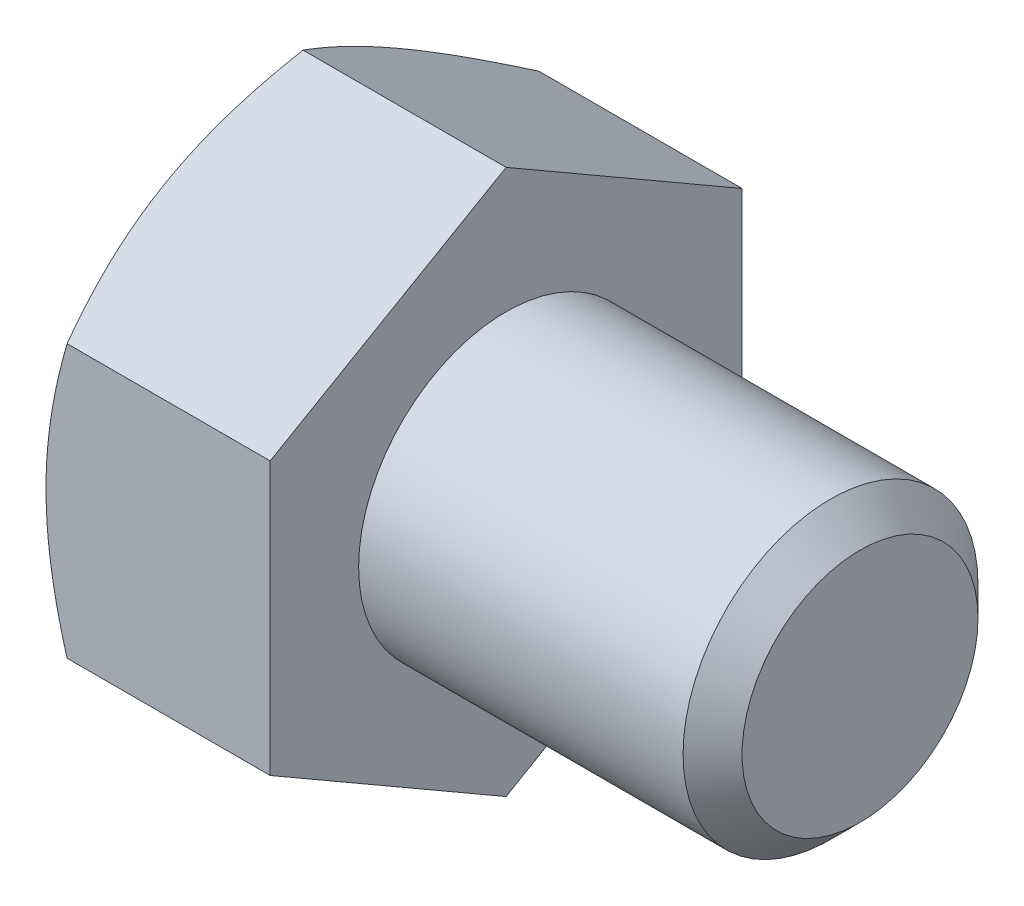
ISO-10303-21;
HEADER;
FILE_DESCRIPTION(('STEP AP214'),'2;1');
FILE_NAME('part.step','',(''),(''),'','','');
FILE_SCHEMA(('AUTOMOTIVE_DESIGN { 1 0 10303 214 1 1 1 1 }'));
ENDSEC;
DATA;
#1=APPLICATION_CONTEXT('core data for automotive mechanical design processes');
#2=APPLICATION_PROTOCOL_DEFINITION('international standard','automotive_design',2000,#1);
#3=PRODUCT_CONTEXT('',#1,'mechanical');
#4=PRODUCT('Part','Part','',(#3));
#5=PRODUCT_RELATED_PRODUCT_CATEGORY('part','',(#4));
#6=PRODUCT_DEFINITION_FORMATION('','',#4);
#7=PRODUCT_DEFINITION_CONTEXT('part definition',#1,'design');
#8=PRODUCT_DEFINITION('design','',#6,#7);
#9=PRODUCT_DEFINITION_SHAPE('','',#8);
#10=(LENGTH_UNIT() NAMED_UNIT(*) SI_UNIT(.MILLI.,.METRE.));
#11=(NAMED_UNIT(*) PLANE_ANGLE_UNIT() SI_UNIT($,.RADIAN.));
#12=(NAMED_UNIT(*) SI_UNIT($,.STERADIAN.) SOLID_ANGLE_UNIT());
#13=UNCERTAINTY_MEASURE_WITH_UNIT(LENGTH_MEASURE(1.E-05),#10,'distance_accuracy_value','');
#14=(GEOMETRIC_REPRESENTATION_CONTEXT(3) GLOBAL_UNCERTAINTY_ASSIGNED_CONTEXT((#13)) GLOBAL_UNIT_ASSIGNED_CONTEXT((#10,
#11,#12)) REPRESENTATION_CONTEXT('',''));
#15=CARTESIAN_POINT('',(0.,0.,0.));
#16=DIRECTION('',(0.,0.,1.));
#17=DIRECTION('',(1.,0.,0.));
#18=AXIS2_PLACEMENT_3D('',#15,#16,#17);
#19=CARTESIAN_POINT('',(3.8,2.5,0.));
#20=DIRECTION('',(-1.,0.,0.));
#21=DIRECTION('',(0.,0.,1.));
#22=AXIS2_PLACEMENT_3D('',#19,#20,#21);
#23=PLANE('',#22);
#24=CARTESIAN_POINT('',(3.8,0.,0.));
#25=DIRECTION('',(-1.,0.,0.));
#26=DIRECTION('',(0.,0.,1.));
#27=AXIS2_PLACEMENT_3D('',#24,#25,#26);
#28=CIRCLE('',#27,2.5);
#29=CARTESIAN_POINT('',(3.8,0.,2.5));
#30=VERTEX_POINT('',#29);
#31=EDGE_CURVE('E193',#30,#30,#28,.T.);
#32=ORIENTED_EDGE('',*,*,#31,.T.);
#33=EDGE_LOOP('',(#32));
#34=FACE_BOUND('',#33,.T.);
#35=DIRECTION('',(0.,1.,0.));
#36=VECTOR('',#35,1.);
#37=CARTESIAN_POINT('',(3.8,-2.30940108685021,4.));
#38=LINE('',#37,#36);
#39=CARTESIAN_POINT('',(3.8,-2.30940108685021,4.));
#40=VERTEX_POINT('',#39);
#41=CARTESIAN_POINT('',(3.8,2.30940108685047,4.));
#42=VERTEX_POINT('',#41);
#43=EDGE_CURVE('E57',#40,#42,#38,.T.);
#44=ORIENTED_EDGE('',*,*,#43,.F.);
#45=DIRECTION('',(0.,0.50000000163871,0.866025402838329));
#46=VECTOR('',#45,1.);
#47=CARTESIAN_POINT('',(3.8,-4.61880217370055,0.));
#48=LINE('',#47,#46);
#49=CARTESIAN_POINT('',(3.8,-4.61880217370055,0.));
#50=VERTEX_POINT('',#49);
#51=EDGE_CURVE('E130',#50,#40,#48,.T.);
#52=ORIENTED_EDGE('',*,*,#51,.F.);
#53=DIRECTION('',(0.,-0.50000000163871,0.866025402838329));
#54=VECTOR('',#53,1.);
#55=CARTESIAN_POINT('',(3.8,-2.30940108685021,-4.));
#56=LINE('',#55,#54);
#57=CARTESIAN_POINT('',(3.8,-2.30940108685021,-4.));
#58=VERTEX_POINT('',#57);
#59=EDGE_CURVE('E128',#58,#50,#56,.T.);
#60=ORIENTED_EDGE('',*,*,#59,.F.);
#61=DIRECTION('',(0.,-1.,0.));
#62=VECTOR('',#61,1.);
#63=CARTESIAN_POINT('',(3.8,2.30940108685047,-4.));
#64=LINE('',#63,#62);
#65=CARTESIAN_POINT('',(3.8,2.30940108685047,-4.));
#66=VERTEX_POINT('',#65);
#67=EDGE_CURVE('E111',#66,#58,#64,.T.);
#68=ORIENTED_EDGE('',*,*,#67,.F.);
#69=DIRECTION('',(0.,-0.50000000163871,-0.866025402838329));
#70=VECTOR('',#69,1.);
#71=CARTESIAN_POINT('',(3.8,4.61880217370081,0.));
#72=LINE('',#71,#70);
#73=CARTESIAN_POINT('',(3.8,4.61880217370081,0.));
#74=VERTEX_POINT('',#73);
#75=EDGE_CURVE('E120',#74,#66,#72,.T.);
#76=ORIENTED_EDGE('',*,*,#75,.F.);
#77=DIRECTION('',(0.,0.50000000163871,-0.866025402838329));
#78=VECTOR('',#77,1.);
#79=CARTESIAN_POINT('',(3.8,2.30940108685047,4.));
#80=LINE('',#79,#78);
#81=EDGE_CURVE('E124',#42,#74,#80,.T.);
#82=ORIENTED_EDGE('',*,*,#81,.F.);
#83=EDGE_LOOP('',(#44,#52,#60,#68,#76,#82));
#84=FACE_BOUND('',#83,.T.);
#85=ADVANCED_FACE('F34',(#34,#84),#23,.F.);
#86=CARTESIAN_POINT('',(-25.4,0.,0.));
#87=DIRECTION('',(-1.,0.,0.));
#88=DIRECTION('',(0.,0.,1.));
#89=AXIS2_PLACEMENT_3D('',#86,#87,#88);
#90=CYLINDRICAL_SURFACE('',#89,2.5);
#91=CARTESIAN_POINT('',(9.29999999999999,0.,0.));
#92=DIRECTION('',(1.,0.,0.));
#93=DIRECTION('',(0.,0.,-1.));
#94=AXIS2_PLACEMENT_3D('',#91,#92,#93);
#95=CIRCLE('',#94,2.5);
#96=CARTESIAN_POINT('',(9.29999999999999,0.,-2.5));
#97=VERTEX_POINT('',#96);
#98=EDGE_CURVE('E42',#97,#97,#95,.F.);
#99=ORIENTED_EDGE('',*,*,#98,.T.);
#100=EDGE_LOOP('',(#99));
#101=FACE_BOUND('',#100,.T.);
#102=ORIENTED_EDGE('',*,*,#31,.F.);
#103=EDGE_LOOP('',(#102));
#104=FACE_BOUND('',#103,.T.);
#105=ADVANCED_FACE('F36',(#101,#104),#90,.T.);
#106=CARTESIAN_POINT('',(9.8,2.5,0.));
#107=DIRECTION('',(1.,0.,0.));
#108=DIRECTION('',(0.,0.,-1.));
#109=AXIS2_PLACEMENT_3D('',#106,#107,#108);
#110=PLANE('',#109);
#111=CARTESIAN_POINT('',(9.8,0.,0.));
#112=DIRECTION('',(1.,0.,0.));
#113=DIRECTION('',(0.,0.,-1.));
#114=AXIS2_PLACEMENT_3D('',#111,#112,#113);
#115=CIRCLE('',#114,2.);
#116=CARTESIAN_POINT('',(9.8,0.,-2.));
#117=VERTEX_POINT('',#116);
#118=EDGE_CURVE('E11',#117,#117,#115,.T.);
#119=ORIENTED_EDGE('',*,*,#118,.T.);
#120=EDGE_LOOP('',(#119));
#121=FACE_BOUND('',#120,.T.);
#122=ADVANCED_FACE('F176',(#121),#110,.T.);
#123=CARTESIAN_POINT('',(3.8,-2.30940108685021,4.));
#124=DIRECTION('',(0.,0.,1.));
#125=DIRECTION('',(0.,-1.,0.));
#126=AXIS2_PLACEMENT_3D('',#123,#124,#125);
#127=PLANE('',#126);
#128=DIRECTION('',(-1.,0.,0.));
#129=VECTOR('',#128,1.);
#130=CARTESIAN_POINT('',(3.8,-2.30940108685021,4.));
#131=LINE('',#130,#129);
#132=CARTESIAN_POINT('',(0.35726559282139,-2.30940108685021,4.));
#133=VERTEX_POINT('',#132);
#134=EDGE_CURVE('E137',#40,#133,#131,.T.);
#135=ORIENTED_EDGE('',*,*,#134,.F.);
#136=ORIENTED_EDGE('',*,*,#43,.T.);
#137=DIRECTION('',(-1.,0.,0.));
#138=VECTOR('',#137,1.);
#139=CARTESIAN_POINT('',(3.8,2.30940108685047,4.));
#140=LINE('',#139,#138);
#141=CARTESIAN_POINT('',(0.357265592821462,2.30940108685047,4.));
#142=VERTEX_POINT('',#141);
#143=EDGE_CURVE('E136',#42,#142,#140,.T.);
#144=ORIENTED_EDGE('',*,*,#143,.T.);
#145=CARTESIAN_POINT('',(1.91411207050557,-6.12488284911128,4.));
#146=CARTESIAN_POINT('',(1.82924143407423,-5.94926014497977,4.00000000000001));
#147=CARTESIAN_POINT('',(1.74521447868329,-5.77322221201618,4.));
#148=CARTESIAN_POINT('',(1.57933003819625,-5.42009137445534,4.));
#149=CARTESIAN_POINT('',(1.49747292871725,-5.24299829361886,4.));
#150=CARTESIAN_POINT('',(1.33597906289909,-4.88657600917898,4.));
#151=CARTESIAN_POINT('',(1.25635769330726,-4.70723980861795,4.));
#152=CARTESIAN_POINT('',(1.10053486918804,-4.3470934254322,4.));
#153=CARTESIAN_POINT('',(1.0243332363971,-4.16628332022092,4.));
#154=CARTESIAN_POINT('',(0.875354558746429,-3.80065688980505,4.));
#155=CARTESIAN_POINT('',(0.802631043961964,-3.61581863286855,4.));
#156=CARTESIAN_POINT('',(0.662879678014749,-3.24396193963803,4.));
#157=CARTESIAN_POINT('',(0.595852460533937,-3.05694326340907,4.));
#158=CARTESIAN_POINT('',(0.469294684217645,-2.68081230741806,4.));
#159=CARTESIAN_POINT('',(0.409748187612698,-2.49170544564091,4.));
#160=CARTESIAN_POINT('',(0.30008572336187,-2.11080331995523,4.));
#161=CARTESIAN_POINT('',(0.249966773457976,-1.91900892690383,4.));
#162=CARTESIAN_POINT('',(0.161592536574721,-1.53260074712083,4.));
#163=CARTESIAN_POINT('',(0.123340407870541,-1.33798622423089,4.));
#164=CARTESIAN_POINT('',(0.0612753077680044,-0.946410783763161,4.));
#165=CARTESIAN_POINT('',(0.0374623491237198,-0.749449864112967,4.));
#166=CARTESIAN_POINT('',(0.00638220331307707,-0.355459653933766,4.));
#167=CARTESIAN_POINT('',(-0.000989732727249493,-0.158438841624105,4.));
#168=CARTESIAN_POINT('',(0.00120381620110225,0.23546484051504,4.));
#169=CARTESIAN_POINT('',(0.010764904501223,0.432347732877177,4.));
#170=CARTESIAN_POINT('',(0.0408779562953358,0.768553458943435,4.));
#171=CARTESIAN_POINT('',(0.0575083510692321,0.908247206742812,4.));
#172=CARTESIAN_POINT('',(0.0982121199221649,1.18655561740683,4.));
#173=CARTESIAN_POINT('',(0.122286667829395,1.32517010655262,4.));
#174=CARTESIAN_POINT('',(0.20441305736776,1.73928168633864,4.));
#175=CARTESIAN_POINT('',(0.272346499738698,2.01283770618391,4.));
#176=CARTESIAN_POINT('',(0.389513421409693,2.4221727073608,4.));
#177=CARTESIAN_POINT('',(0.43171082242019,2.56008534252284,4.));
#178=CARTESIAN_POINT('',(0.520281102969559,2.83447117565622,4.));
#179=CARTESIAN_POINT('',(0.566651102551071,2.97094529491654,4.));
#180=CARTESIAN_POINT('',(0.662601699724829,3.24188340523882,4.));
#181=CARTESIAN_POINT('',(0.71216275686328,3.37635438688183,4.));
#182=CARTESIAN_POINT('',(0.814193851020142,3.64425303314445,4.));
#183=CARTESIAN_POINT('',(0.866665063740089,3.77768025087655,4.));
#184=CARTESIAN_POINT('',(0.920304177357636,3.91062502490282,4.));
#185=B_SPLINE_CURVE_WITH_KNOTS('',3,(#145,#146,#147,#148,#149,#150,#151,#152,#153,#154,#155,
#156,#157,#158,#159,#160,#161,#162,#163,#164,#165,#166,#167,#168,#169,#170,#171,#172,#173,#174,
#175,#176,#177,#178,#179,#180,#181,#182,#183,#184),.UNSPECIFIED.,.F.,.F.,(4,2,2,2,2,2,2,2,2,2,2,
2,2,2,2,2,2,2,2,4),(0.,0.585172133086107,1.17044491108198,1.75906694985072,2.34765826928943,
2.94347582869784,3.53935958302679,4.13395145670743,4.72835492300021,5.32291645035583,
5.91747850288497,6.50824153352631,7.09885119472812,7.52068574675965,7.94258684954709,
8.78701696632151,9.21965414324304,9.65199496834923,10.0819022935389,10.5119845844856),.UNSPECIFIED.);
#186=CARTESIAN_POINT('',(0.,0.,4.));
#187=VERTEX_POINT('',#186);
#188=EDGE_CURVE('E178',#187,#142,#185,.T.);
#189=ORIENTED_EDGE('',*,*,#188,.F.);
#190=EDGE_CURVE('E185',#133,#187,#185,.T.);
#191=ORIENTED_EDGE('',*,*,#190,.F.);
#192=EDGE_LOOP('',(#135,#136,#144,#189,#191));
#193=FACE_BOUND('',#192,.T.);
#194=ADVANCED_FACE('F172',(#193),#127,.T.);
#195=CARTESIAN_POINT('',(3.8,-4.61880217370055,0.));
#196=DIRECTION('',(0.,-0.866025402838329,0.50000000163871));
#197=DIRECTION('',(0.,-0.50000000163871,-0.866025402838329));
#198=AXIS2_PLACEMENT_3D('',#195,#196,#197);
#199=PLANE('',#198);
#200=DIRECTION('',(-1.,0.,0.));
#201=VECTOR('',#200,1.);
#202=CARTESIAN_POINT('',(3.8,-4.61880217370055,0.));
#203=LINE('',#202,#201);
#204=CARTESIAN_POINT('',(0.357265601561139,-4.61880217370055,0.));
#205=VERTEX_POINT('',#204);
#206=EDGE_CURVE('E141',#50,#205,#203,.T.);
#207=ORIENTED_EDGE('',*,*,#206,.F.);
#208=ORIENTED_EDGE('',*,*,#51,.T.);
#209=ORIENTED_EDGE('',*,*,#134,.T.);
#210=CARTESIAN_POINT('',(0.357332270728034,-4.61891764375489,-0.000200000000001266));
#211=CARTESIAN_POINT('',(0.298717884872984,-4.5174315032524,0.175579150846262));
#212=CARTESIAN_POINT('',(0.245410332260443,-4.41506934012742,0.352875617376607));
#213=CARTESIAN_POINT('',(0.152361680715636,-4.20857252264166,0.710538595300267));
#214=CARTESIAN_POINT('',(0.112653498596863,-4.10443419924972,0.890911461641944));
#215=CARTESIAN_POINT('',(0.0508422241018666,-3.89744814501029,1.24942182247619));
#216=CARTESIAN_POINT('',(0.0283277399997143,-3.79463226063427,1.42750415726238));
#217=CARTESIAN_POINT('',(0.00145063101350322,-3.58851673252128,1.7845067226229));
#218=CARTESIAN_POINT('',(-0.00293425097148781,-3.48521783790868,1.96342565567578));
#219=CARTESIAN_POINT('',(0.00619008011451904,-3.29219971594881,2.29774284823086));
#220=CARTESIAN_POINT('',(0.017458960889836,-3.20245158776585,2.45319116544867));
#221=CARTESIAN_POINT('',(0.0531739970667138,-3.0235400370613,2.76307505997572));
#222=CARTESIAN_POINT('',(0.0776323516191489,-2.93437723331403,2.91750956553643));
#223=CARTESIAN_POINT('',(0.13877607004079,-2.75509683061233,3.22803233046023));
#224=CARTESIAN_POINT('',(0.175720608348018,-2.66500192131106,3.38408129019142));
#225=CARTESIAN_POINT('',(0.259570076360999,-2.48615581226107,3.69385183644834));
#226=CARTESIAN_POINT('',(0.306455305574318,-2.3974023214031,3.84757739129168));
#227=CARTESIAN_POINT('',(0.35733226198763,-2.30928561679587,4.0002));
#228=B_SPLINE_CURVE_WITH_KNOTS('',3,(#210,#211,#212,#213,#214,#215,#216,#217,#218,#219,#220,
#221,#222,#223,#224,#225,#226,#227),.UNSPECIFIED.,.F.,.F.,(4,2,2,2,2,2,2,2,4),(0.,
0.634047838434344,1.26961969774217,1.88946158031554,2.5085422775577,3.04757826336224,
3.58711366925116,4.13861653785011,4.68903648524492),.UNSPECIFIED.);
#229=CARTESIAN_POINT('',(0.,-3.46410162270654,2.00000001310962));
#230=VERTEX_POINT('',#229);
#231=EDGE_CURVE('E187',#230,#133,#228,.T.);
#232=ORIENTED_EDGE('',*,*,#231,.F.);
#233=EDGE_CURVE('E186',#205,#230,#228,.T.);
#234=ORIENTED_EDGE('',*,*,#233,.F.);
#235=EDGE_LOOP('',(#207,#208,#209,#232,#234));
#236=FACE_BOUND('',#235,.T.);
#237=ADVANCED_FACE('F175',(#236),#199,.T.);
#238=CARTESIAN_POINT('',(3.8,-2.30940108685021,-4.));
#239=DIRECTION('',(0.,-0.866025402838329,-0.50000000163871));
#240=DIRECTION('',(0.,0.50000000163871,-0.866025402838329));
#241=AXIS2_PLACEMENT_3D('',#238,#239,#240);
#242=PLANE('',#241);
#243=DIRECTION('',(-1.,0.,0.));
#244=VECTOR('',#243,1.);
#245=CARTESIAN_POINT('',(3.8,-2.30940108685021,-4.));
#246=LINE('',#245,#244);
#247=CARTESIAN_POINT('',(0.35726559282139,-2.30940108685021,-4.));
#248=VERTEX_POINT('',#247);
#249=EDGE_CURVE('E117',#58,#248,#246,.T.);
#250=ORIENTED_EDGE('',*,*,#249,.F.);
#251=ORIENTED_EDGE('',*,*,#59,.T.);
#252=ORIENTED_EDGE('',*,*,#206,.T.);
#253=CARTESIAN_POINT('',(0.35733226198763,-2.30928561679587,-4.0002));
#254=CARTESIAN_POINT('',(0.298717876844807,-2.41077175705273,-3.82442084957919));
#255=CARTESIAN_POINT('',(0.245410324990068,-2.51313391993055,-3.64712438347694));
#256=CARTESIAN_POINT('',(0.152361675020789,-2.71963073689828,-3.28946140645052));
#257=CARTESIAN_POINT('',(0.112653493718921,-2.82376906001921,-3.10908854057826));
#258=CARTESIAN_POINT('',(0.0508422208496781,-3.03075511370645,-2.75057818070044));
#259=CARTESIAN_POINT('',(0.0283277375578539,-3.13357099780214,-2.57249584639978));
#260=CARTESIAN_POINT('',(0.0014506301340083,-3.33968652532137,-2.21549328206768));
#261=CARTESIAN_POINT('',(-0.0029342510984508,-3.44298541962059,-2.03657434955761));
#262=CARTESIAN_POINT('',(0.0061900812974301,-3.63600354156816,-1.70225715702381));
#263=CARTESIAN_POINT('',(0.0174589627405232,-3.72575167005462,-1.54680883928033));
#264=CARTESIAN_POINT('',(0.0531740002868179,-3.90466322134178,-1.23692494374417));
#265=CARTESIAN_POINT('',(0.0776323555410334,-3.99382602536814,-1.08249043770006));
#266=CARTESIAN_POINT('',(0.138776075372699,-4.17310642862236,-0.771967671819272));
#267=CARTESIAN_POINT('',(0.175720614388896,-4.26320133819654,-0.615918711615387));
#268=CARTESIAN_POINT('',(0.259570083783939,-4.44204744777679,-0.306148164440034));
#269=CARTESIAN_POINT('',(0.306455313670071,-4.53080093889216,-0.152422609150856));
#270=CARTESIAN_POINT('',(0.357332270728034,-4.61891764375489,0.000199999999998629));
#271=B_SPLINE_CURVE_WITH_KNOTS('',3,(#253,#254,#255,#256,#257,#258,#259,#260,#261,#262,#263,
#264,#265,#266,#267,#268,#269,#270),.UNSPECIFIED.,.F.,.F.,(4,2,2,2,2,2,2,2,4),(0.,
0.634047836422559,1.2696196936697,1.88946157430579,2.50854226962757,3.04757825737168,
3.58711366520643,4.1386165358392,4.68903648524489),.UNSPECIFIED.);
#272=CARTESIAN_POINT('',(0.,-3.46410162270654,-2.00000001310962));
#273=VERTEX_POINT('',#272);
#274=EDGE_CURVE('E257',#273,#205,#271,.T.);
#275=ORIENTED_EDGE('',*,*,#274,.F.);
#276=EDGE_CURVE('E266',#248,#273,#271,.T.);
#277=ORIENTED_EDGE('',*,*,#276,.F.);
#278=EDGE_LOOP('',(#250,#251,#252,#275,#277));
#279=FACE_BOUND('',#278,.T.);
#280=ADVANCED_FACE('F264',(#279),#242,.T.);
#281=CARTESIAN_POINT('',(3.8,2.30940108685047,-4.));
#282=DIRECTION('',(0.,0.,-1.));
#283=DIRECTION('',(-1.,0.,0.));
#284=AXIS2_PLACEMENT_3D('',#281,#282,#283);
#285=PLANE('',#284);
#286=DIRECTION('',(-1.,0.,0.));
#287=VECTOR('',#286,1.);
#288=CARTESIAN_POINT('',(3.8,2.30940108685047,-4.));
#289=LINE('',#288,#287);
#290=CARTESIAN_POINT('',(0.357265592821464,2.30940108685047,-4.));
#291=VERTEX_POINT('',#290);
#292=EDGE_CURVE('E106',#66,#291,#289,.T.);
#293=ORIENTED_EDGE('',*,*,#292,.F.);
#294=ORIENTED_EDGE('',*,*,#67,.T.);
#295=ORIENTED_EDGE('',*,*,#249,.T.);
#296=CARTESIAN_POINT('',(1.91411207050557,-6.12488284911128,-4.));
#297=CARTESIAN_POINT('',(1.82924143407423,-5.94926014497977,-4.));
#298=CARTESIAN_POINT('',(1.74521447868329,-5.77322221201618,-4.));
#299=CARTESIAN_POINT('',(1.57933003819625,-5.42009137445534,-4.));
#300=CARTESIAN_POINT('',(1.49747292871725,-5.24299829361886,-4.));
#301=CARTESIAN_POINT('',(1.33597906289909,-4.88657600917898,-4.));
#302=CARTESIAN_POINT('',(1.25635769330726,-4.70723980861795,-4.));
#303=CARTESIAN_POINT('',(1.10053486918804,-4.3470934254322,-4.));
#304=CARTESIAN_POINT('',(1.02433323639709,-4.16628332022092,-4.));
#305=CARTESIAN_POINT('',(0.875354558746428,-3.80065688980505,-4.));
#306=CARTESIAN_POINT('',(0.802631043961963,-3.61581863286855,-4.));
#307=CARTESIAN_POINT('',(0.662879678014749,-3.24396193963803,-4.));
#308=CARTESIAN_POINT('',(0.595852460533937,-3.05694326340907,-4.));
#309=CARTESIAN_POINT('',(0.469294684217645,-2.68081230741806,-4.));
#310=CARTESIAN_POINT('',(0.409748187612697,-2.49170544564091,-4.));
#311=CARTESIAN_POINT('',(0.30008572336187,-2.11080331995523,-4.));
#312=CARTESIAN_POINT('',(0.249966773457977,-1.91900892690383,-4.));
#313=CARTESIAN_POINT('',(0.161592536574723,-1.53260074712083,-4.));
#314=CARTESIAN_POINT('',(0.123340407870542,-1.33798622423089,-4.));
#315=CARTESIAN_POINT('',(0.0612753077680048,-0.946410783763161,-4.));
#316=CARTESIAN_POINT('',(0.0374623491237204,-0.749449864112967,-4.));
#317=CARTESIAN_POINT('',(0.00638220331307796,-0.355459653933767,-4.));
#318=CARTESIAN_POINT('',(-0.000989732727248507,-0.158438841624105,-4.));
#319=CARTESIAN_POINT('',(0.0012038162011033,0.23546484051504,-4.));
#320=CARTESIAN_POINT('',(0.010764904501224,0.432347732877177,-4.));
#321=CARTESIAN_POINT('',(0.0408779562953373,0.768553458943436,-4.));
#322=CARTESIAN_POINT('',(0.0575083510692339,0.908247206742813,-4.));
#323=CARTESIAN_POINT('',(0.0982121199221671,1.18655561740683,-4.));
#324=CARTESIAN_POINT('',(0.122286667829397,1.32517010655262,-4.));
#325=CARTESIAN_POINT('',(0.204413057367762,1.73928168633864,-4.));
#326=CARTESIAN_POINT('',(0.2723464997387,2.01283770618391,-4.));
#327=CARTESIAN_POINT('',(0.389513421409697,2.42217270736081,-4.));
#328=CARTESIAN_POINT('',(0.431710822420194,2.56008534252284,-4.));
#329=CARTESIAN_POINT('',(0.520281102969563,2.83447117565622,-4.));
#330=CARTESIAN_POINT('',(0.566651102551075,2.97094529491654,-4.));
#331=CARTESIAN_POINT('',(0.662601699724833,3.24188340523882,-4.));
#332=CARTESIAN_POINT('',(0.712162756863284,3.37635438688183,-4.));
#333=CARTESIAN_POINT('',(0.814193851020146,3.64425303314446,-4.));
#334=CARTESIAN_POINT('',(0.866665063740093,3.77768025087655,-4.));
#335=CARTESIAN_POINT('',(0.92030417735764,3.91062502490283,-4.));
#336=B_SPLINE_CURVE_WITH_KNOTS('',3,(#296,#297,#298,#299,#300,#301,#302,#303,#304,#305,#306,
#307,#308,#309,#310,#311,#312,#313,#314,#315,#316,#317,#318,#319,#320,#321,#322,#323,#324,#325,
#326,#327,#328,#329,#330,#331,#332,#333,#334,#335),.UNSPECIFIED.,.F.,.F.,(4,2,2,2,2,2,2,2,2,2,2,
2,2,2,2,2,2,2,2,4),(0.,0.585172133086109,1.17044491108198,1.75906694985073,2.34765826928943,
2.94347582869785,3.53935958302679,4.13395145670743,4.72835492300021,5.32291645035583,
5.91747850288497,6.50824153352631,7.09885119472812,7.52068574675965,7.94258684954709,
8.78701696632152,9.21965414324304,9.65199496834923,10.0819022935389,10.5119845844856),.UNSPECIFIED.);
#337=CARTESIAN_POINT('',(0.,0.,-4.));
#338=VERTEX_POINT('',#337);
#339=EDGE_CURVE('E268',#338,#248,#336,.F.);
#340=ORIENTED_EDGE('',*,*,#339,.F.);
#341=EDGE_CURVE('E114',#291,#338,#336,.F.);
#342=ORIENTED_EDGE('',*,*,#341,.F.);
#343=EDGE_LOOP('',(#293,#294,#295,#340,#342));
#344=FACE_BOUND('',#343,.T.);
#345=ADVANCED_FACE('F108',(#344),#285,.T.);
#346=CARTESIAN_POINT('',(3.8,4.61880217370081,0.));
#347=DIRECTION('',(0.,0.866025402838329,-0.50000000163871));
#348=DIRECTION('',(0.,0.50000000163871,0.866025402838329));
#349=AXIS2_PLACEMENT_3D('',#346,#347,#348);
#350=PLANE('',#349);
#351=DIRECTION('',(-1.,0.,0.));
#352=VECTOR('',#351,1.);
#353=CARTESIAN_POINT('',(3.8,4.61880217370081,0.));
#354=LINE('',#353,#352);
#355=CARTESIAN_POINT('',(0.357265601561286,4.61880217370081,0.));
#356=VERTEX_POINT('',#355);
#357=EDGE_CURVE('E49',#74,#356,#354,.T.);
#358=ORIENTED_EDGE('',*,*,#357,.F.);
#359=ORIENTED_EDGE('',*,*,#75,.T.);
#360=ORIENTED_EDGE('',*,*,#292,.T.);
#361=CARTESIAN_POINT('',(0.357332270728182,4.61891764375515,0.000199999999999688));
#362=CARTESIAN_POINT('',(0.298717884873128,4.51743150325265,-0.175579150846273));
#363=CARTESIAN_POINT('',(0.245410332260584,4.41506934012767,-0.352875617376628));
#364=CARTESIAN_POINT('',(0.152361680715772,4.2085725226419,-0.710538595300307));
#365=CARTESIAN_POINT('',(0.112653498596997,4.10443419924995,-0.890911461641994));
#366=CARTESIAN_POINT('',(0.0508422241019975,3.89744814501051,-1.24942182247626));
#367=CARTESIAN_POINT('',(0.028327739999844,3.79463226063448,-1.42750415726246));
#368=CARTESIAN_POINT('',(0.0014506310136314,3.58851673252148,-1.784506722623));
#369=CARTESIAN_POINT('',(-0.00293425097136011,3.48521783790887,-1.96342565567589));
#370=CARTESIAN_POINT('',(0.00619008011464692,3.29219971594901,-2.29774284823097));
#371=CARTESIAN_POINT('',(0.0174589608899627,3.20245158776605,-2.45319116544877));
#372=CARTESIAN_POINT('',(0.0531739970668348,3.02354003706151,-2.7630750599758));
#373=CARTESIAN_POINT('',(0.0776323516192655,2.93437723331425,-2.91750956553649));
#374=CARTESIAN_POINT('',(0.138776070040896,2.75509683061256,-3.22803233046028));
#375=CARTESIAN_POINT('',(0.175720608348119,2.6650019213113,-3.38408129019146));
#376=CARTESIAN_POINT('',(0.259570076361088,2.48615581226132,-3.69385183644836));
#377=CARTESIAN_POINT('',(0.306455305574399,2.39740232140335,-3.84757739129169));
#378=CARTESIAN_POINT('',(0.357332261987703,2.30928561679612,-4.0002));
#379=B_SPLINE_CURVE_WITH_KNOTS('',3,(#361,#362,#363,#364,#365,#366,#367,#368,#369,#370,#371,
#372,#373,#374,#375,#376,#377,#378),.UNSPECIFIED.,.F.,.F.,(4,2,2,2,2,2,2,2,4),(0.,
0.634047838434378,1.26961969774224,1.88946158031565,2.50854227755784,3.04757826336234,
3.58711366925122,4.13861653785014,4.68903648524491),.UNSPECIFIED.);
#380=CARTESIAN_POINT('',(0.,3.46410162270673,-2.00000001310974));
#381=VERTEX_POINT('',#380);
#382=EDGE_CURVE('E155',#381,#291,#379,.T.);
#383=ORIENTED_EDGE('',*,*,#382,.F.);
#384=EDGE_CURVE('E245',#356,#381,#379,.T.);
#385=ORIENTED_EDGE('',*,*,#384,.F.);
#386=EDGE_LOOP('',(#358,#359,#360,#383,#385));
#387=FACE_BOUND('',#386,.T.);
#388=ADVANCED_FACE('F121',(#387),#350,.T.);
#389=CARTESIAN_POINT('',(3.8,2.30940108685047,4.));
#390=DIRECTION('',(0.,0.866025402838329,0.50000000163871));
#391=DIRECTION('',(0.,-0.50000000163871,0.866025402838329));
#392=AXIS2_PLACEMENT_3D('',#389,#390,#391);
#393=PLANE('',#392);
#394=ORIENTED_EDGE('',*,*,#143,.F.);
#395=ORIENTED_EDGE('',*,*,#81,.T.);
#396=ORIENTED_EDGE('',*,*,#357,.T.);
#397=CARTESIAN_POINT('',(0.357332261987702,2.30928561679613,4.0002));
#398=CARTESIAN_POINT('',(0.298717876844882,2.41077175705299,3.82442084957918));
#399=CARTESIAN_POINT('',(0.245410324990146,2.51313391993081,3.64712438347692));
#400=CARTESIAN_POINT('',(0.152361675020876,2.71963073689855,3.2894614064505));
#401=CARTESIAN_POINT('',(0.112653493719013,2.82376906001948,3.10908854057823));
#402=CARTESIAN_POINT('',(0.0508422208497803,3.03075511370673,2.75057818070039));
#403=CARTESIAN_POINT('',(0.0283277375579618,3.13357099780243,2.57249584639973));
#404=CARTESIAN_POINT('',(0.0014506301341281,3.33968652532166,2.21549328206762));
#405=CARTESIAN_POINT('',(-0.0029342510983249,3.44298541962088,2.03657434955754));
#406=CARTESIAN_POINT('',(0.00619008129756705,3.63600354156845,1.70225715702375));
#407=CARTESIAN_POINT('',(0.0174589627406643,3.72575167005491,1.54680883928027));
#408=CARTESIAN_POINT('',(0.0531740002869653,3.90466322134207,1.23692494374412));
#409=CARTESIAN_POINT('',(0.077632355541183,3.99382602536843,1.08249043770002));
#410=CARTESIAN_POINT('',(0.138776075372851,4.17310642862264,0.77196767181924));
#411=CARTESIAN_POINT('',(0.175720614389048,4.26320133819681,0.615918711615361));
#412=CARTESIAN_POINT('',(0.259570083784089,4.44204744777705,0.30614816444002));
#413=CARTESIAN_POINT('',(0.30645531367022,4.53080093889242,0.152422609150848));
#414=CARTESIAN_POINT('',(0.357332270728182,4.61891764375515,-0.000200000000000769));
#415=B_SPLINE_CURVE_WITH_KNOTS('',3,(#397,#398,#399,#400,#401,#402,#403,#404,#405,#406,#407,
#408,#409,#410,#411,#412,#413,#414),.UNSPECIFIED.,.F.,.F.,(4,2,2,2,2,2,2,2,4),(0.,
0.634047836422576,1.26961969366974,1.88946157430584,2.50854226962764,3.04757825737174,
3.58711366520647,4.13861653583922,4.68903648524488),.UNSPECIFIED.);
#416=CARTESIAN_POINT('',(0.,3.46410162270673,2.00000001310974));
#417=VERTEX_POINT('',#416);
#418=EDGE_CURVE('E140',#417,#356,#415,.T.);
#419=ORIENTED_EDGE('',*,*,#418,.F.);
#420=EDGE_CURVE('E154',#142,#417,#415,.T.);
#421=ORIENTED_EDGE('',*,*,#420,.F.);
#422=EDGE_LOOP('',(#394,#395,#396,#419,#421));
#423=FACE_BOUND('',#422,.T.);
#424=ADVANCED_FACE('F165',(#423),#393,.T.);
#425=CARTESIAN_POINT('',(0.,0.,0.));
#426=DIRECTION('',(1.,0.,0.));
#427=DIRECTION('',(0.,0.,-1.));
#428=AXIS2_PLACEMENT_3D('',#425,#426,#427);
#429=CONICAL_SURFACE('',#428,4.,1.0471975511966);
#430=CARTESIAN_POINT('',(0.,0.,0.));
#431=DIRECTION('',(-1.,0.,0.));
#432=DIRECTION('',(0.,0.,1.));
#433=AXIS2_PLACEMENT_3D('',#430,#431,#432);
#434=CIRCLE('',#433,4.);
#435=EDGE_CURVE('E196',#230,#187,#434,.T.);
#436=ORIENTED_EDGE('',*,*,#435,.F.);
#437=ORIENTED_EDGE('',*,*,#231,.T.);
#438=ORIENTED_EDGE('',*,*,#190,.T.);
#439=EDGE_LOOP('',(#436,#437,#438));
#440=FACE_BOUND('',#439,.T.);
#441=ADVANCED_FACE('F169',(#440),#429,.T.);
#442=EDGE_CURVE('E250',#273,#230,#434,.T.);
#443=ORIENTED_EDGE('',*,*,#442,.F.);
#444=ORIENTED_EDGE('',*,*,#274,.T.);
#445=ORIENTED_EDGE('',*,*,#233,.T.);
#446=EDGE_LOOP('',(#443,#444,#445));
#447=FACE_BOUND('',#446,.T.);
#448=ADVANCED_FACE('F256',(#447),#429,.T.);
#449=ORIENTED_EDGE('',*,*,#339,.T.);
#450=ORIENTED_EDGE('',*,*,#276,.T.);
#451=EDGE_CURVE('E248',#338,#273,#434,.T.);
#452=ORIENTED_EDGE('',*,*,#451,.F.);
#453=EDGE_LOOP('',(#449,#450,#452));
#454=FACE_BOUND('',#453,.T.);
#455=ADVANCED_FACE('F161',(#454),#429,.T.);
#456=ORIENTED_EDGE('',*,*,#382,.T.);
#457=ORIENTED_EDGE('',*,*,#341,.T.);
#458=EDGE_CURVE('E247',#381,#338,#434,.T.);
#459=ORIENTED_EDGE('',*,*,#458,.F.);
#460=EDGE_LOOP('',(#456,#457,#459));
#461=FACE_BOUND('',#460,.T.);
#462=ADVANCED_FACE('F234',(#461),#429,.T.);
#463=EDGE_CURVE('E197',#187,#417,#434,.T.);
#464=ORIENTED_EDGE('',*,*,#463,.F.);
#465=ORIENTED_EDGE('',*,*,#188,.T.);
#466=ORIENTED_EDGE('',*,*,#420,.T.);
#467=EDGE_LOOP('',(#464,#465,#466));
#468=FACE_BOUND('',#467,.T.);
#469=ADVANCED_FACE('F215',(#468),#429,.T.);
#470=CARTESIAN_POINT('',(0.,0.,0.));
#471=DIRECTION('',(-1.,0.,0.));
#472=DIRECTION('',(0.,0.,1.));
#473=AXIS2_PLACEMENT_3D('',#470,#471,#472);
#474=PLANE('',#473);
#475=ORIENTED_EDGE('',*,*,#463,.T.);
#476=EDGE_CURVE('E199',#417,#381,#434,.T.);
#477=ORIENTED_EDGE('',*,*,#476,.T.);
#478=ORIENTED_EDGE('',*,*,#458,.T.);
#479=ORIENTED_EDGE('',*,*,#451,.T.);
#480=ORIENTED_EDGE('',*,*,#442,.T.);
#481=ORIENTED_EDGE('',*,*,#435,.T.);
#482=EDGE_LOOP('',(#475,#477,#478,#479,#480,#481));
#483=FACE_BOUND('',#482,.T.);
#484=ADVANCED_FACE('F213',(#483),#474,.T.);
#485=ORIENTED_EDGE('',*,*,#418,.T.);
#486=ORIENTED_EDGE('',*,*,#384,.T.);
#487=ORIENTED_EDGE('',*,*,#476,.F.);
#488=EDGE_LOOP('',(#485,#486,#487));
#489=FACE_BOUND('',#488,.T.);
#490=ADVANCED_FACE('F207',(#489),#429,.T.);
#491=CARTESIAN_POINT('',(9.29999999999999,0.,0.));
#492=DIRECTION('',(-1.,0.,0.));
#493=DIRECTION('',(0.,0.,1.));
#494=AXIS2_PLACEMENT_3D('',#491,#492,#493);
#495=CONICAL_SURFACE('',#494,2.5,0.785398163397445);
#496=ORIENTED_EDGE('',*,*,#118,.F.);
#497=EDGE_LOOP('',(#496));
#498=FACE_BOUND('',#497,.T.);
#499=ORIENTED_EDGE('',*,*,#98,.F.);
#500=EDGE_LOOP('',(#499));
#501=FACE_BOUND('',#500,.T.);
#502=ADVANCED_FACE('F205',(#498,#501),#495,.T.);
#503=CLOSED_SHELL('',(#85,#105,#122,#194,#237,#280,#345,#388,#424,#441,#448,#455,#462,#469,#484,
#490,#502));
#504=MANIFOLD_SOLID_BREP('B2',#503);
#505=ADVANCED_BREP_SHAPE_REPRESENTATION('',(#18,#504),#14);
#506=SHAPE_DEFINITION_REPRESENTATION(#9,#505);
ENDSEC;
END-ISO-10303-21;
